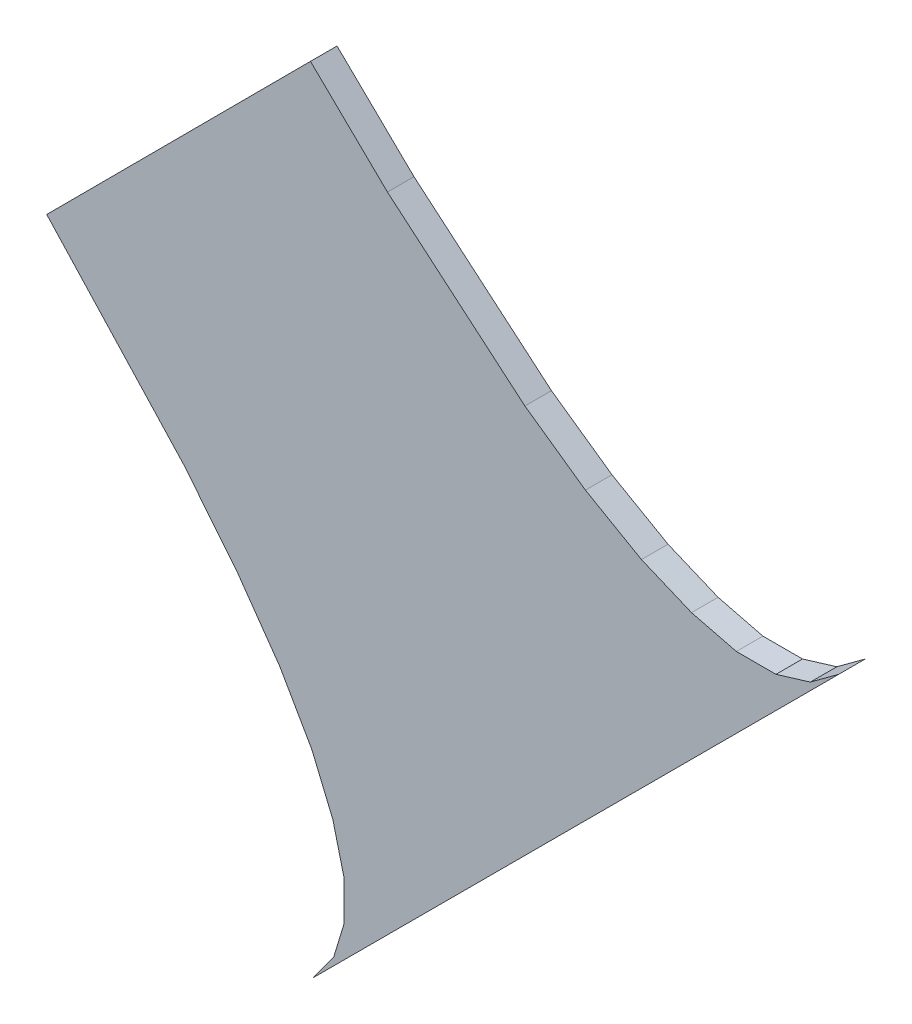
ISO-10303-21;
HEADER;
FILE_DESCRIPTION(('STEP AP214'),'2;1');
FILE_NAME('part.step','',(''),(''),'','','');
FILE_SCHEMA(('AUTOMOTIVE_DESIGN { 1 0 10303 214 1 1 1 1 }'));
ENDSEC;
DATA;
#1=APPLICATION_CONTEXT('core data for automotive mechanical design processes');
#2=APPLICATION_PROTOCOL_DEFINITION('international standard','automotive_design',2000,#1);
#3=PRODUCT_CONTEXT('',#1,'mechanical');
#4=PRODUCT('Part','Part','',(#3));
#5=PRODUCT_RELATED_PRODUCT_CATEGORY('part','',(#4));
#6=PRODUCT_DEFINITION_FORMATION('','',#4);
#7=PRODUCT_DEFINITION_CONTEXT('part definition',#1,'design');
#8=PRODUCT_DEFINITION('design','',#6,#7);
#9=PRODUCT_DEFINITION_SHAPE('','',#8);
#10=(LENGTH_UNIT() NAMED_UNIT(*) SI_UNIT(.MILLI.,.METRE.));
#11=(NAMED_UNIT(*) PLANE_ANGLE_UNIT() SI_UNIT($,.RADIAN.));
#12=(NAMED_UNIT(*) SI_UNIT($,.STERADIAN.) SOLID_ANGLE_UNIT());
#13=UNCERTAINTY_MEASURE_WITH_UNIT(LENGTH_MEASURE(1.E-05),#10,'distance_accuracy_value','');
#14=(GEOMETRIC_REPRESENTATION_CONTEXT(3) GLOBAL_UNCERTAINTY_ASSIGNED_CONTEXT((#13)) GLOBAL_UNIT_ASSIGNED_CONTEXT((#10,
#11,#12)) REPRESENTATION_CONTEXT('',''));
#15=CARTESIAN_POINT('',(0.,0.,0.));
#16=DIRECTION('',(0.,0.,1.));
#17=DIRECTION('',(1.,0.,0.));
#18=AXIS2_PLACEMENT_3D('',#15,#16,#17);
#19=CARTESIAN_POINT('',(78.6999969482422,83.5469970703125,0.));
#20=DIRECTION('',(0.734222558919782,0.678908855424119,0.));
#21=DIRECTION('',(0.678908855424119,-0.734222558919782,0.));
#22=AXIS2_PLACEMENT_3D('',#19,#20,#21);
#23=PLANE('',#22);
#24=DIRECTION('',(0.678908855424119,-0.734222558919782,0.));
#25=VECTOR('',#24,1.);
#26=CARTESIAN_POINT('',(78.6999969482422,83.5469970703125,0.03556));
#27=LINE('',#26,#25);
#28=CARTESIAN_POINT('',(78.6999969482422,83.5469970703125,0.03556));
#29=VERTEX_POINT('',#28);
#30=CARTESIAN_POINT('',(78.8840026855469,83.3479995727539,0.03556));
#31=VERTEX_POINT('',#30);
#32=EDGE_CURVE('E11',#29,#31,#27,.T.);
#33=ORIENTED_EDGE('',*,*,#32,.F.);
#34=DIRECTION('',(0.,0.,1.));
#35=VECTOR('',#34,1.);
#36=CARTESIAN_POINT('',(78.6999969482422,83.5469970703125,0.));
#37=LINE('',#36,#35);
#38=CARTESIAN_POINT('',(78.6999969482422,83.5469970703125,0.));
#39=VERTEX_POINT('',#38);
#40=EDGE_CURVE('E24',#39,#29,#37,.T.);
#41=ORIENTED_EDGE('',*,*,#40,.F.);
#42=DIRECTION('',(0.678908855424119,-0.734222558919782,0.));
#43=VECTOR('',#42,1.);
#44=CARTESIAN_POINT('',(78.6999969482422,83.5469970703125,0.));
#45=LINE('',#44,#43);
#46=CARTESIAN_POINT('',(78.8840026855469,83.3479995727539,0.));
#47=VERTEX_POINT('',#46);
#48=EDGE_CURVE('E172',#39,#47,#45,.T.);
#49=ORIENTED_EDGE('',*,*,#48,.T.);
#50=DIRECTION('',(0.,0.,1.));
#51=VECTOR('',#50,1.);
#52=CARTESIAN_POINT('',(78.8840026855469,83.3479995727539,0.));
#53=LINE('',#52,#51);
#54=EDGE_CURVE('E37',#47,#31,#53,.T.);
#55=ORIENTED_EDGE('',*,*,#54,.T.);
#56=EDGE_LOOP('',(#33,#41,#49,#55));
#57=FACE_BOUND('',#56,.T.);
#58=ADVANCED_FACE('F17',(#57),#23,.F.);
#59=CARTESIAN_POINT('',(78.8840026855469,83.3479995727539,0.));
#60=DIRECTION('',(0.778268366568721,0.627931803302282,0.));
#61=DIRECTION('',(0.627931803302282,-0.778268366568721,0.));
#62=AXIS2_PLACEMENT_3D('',#59,#60,#61);
#63=PLANE('',#62);
#64=DIRECTION('',(0.627931803302282,-0.778268366568721,0.));
#65=VECTOR('',#64,1.);
#66=CARTESIAN_POINT('',(78.8840026855469,83.3479995727539,0.03556));
#67=LINE('',#66,#65);
#68=CARTESIAN_POINT('',(78.9550018310547,83.2600021362305,0.03556));
#69=VERTEX_POINT('',#68);
#70=EDGE_CURVE('E308',#31,#69,#67,.T.);
#71=ORIENTED_EDGE('',*,*,#70,.F.);
#72=ORIENTED_EDGE('',*,*,#54,.F.);
#73=DIRECTION('',(0.627931803302282,-0.778268366568721,0.));
#74=VECTOR('',#73,1.);
#75=CARTESIAN_POINT('',(78.8840026855469,83.3479995727539,0.));
#76=LINE('',#75,#74);
#77=CARTESIAN_POINT('',(78.9550018310547,83.2600021362305,0.));
#78=VERTEX_POINT('',#77);
#79=EDGE_CURVE('E305',#47,#78,#76,.T.);
#80=ORIENTED_EDGE('',*,*,#79,.T.);
#81=DIRECTION('',(0.,0.,1.));
#82=VECTOR('',#81,1.);
#83=CARTESIAN_POINT('',(78.9550018310547,83.2600021362305,0.));
#84=LINE('',#83,#82);
#85=EDGE_CURVE('E303',#78,#69,#84,.T.);
#86=ORIENTED_EDGE('',*,*,#85,.T.);
#87=EDGE_LOOP('',(#71,#72,#80,#86));
#88=FACE_BOUND('',#87,.T.);
#89=ADVANCED_FACE('F316',(#88),#63,.F.);
#90=CARTESIAN_POINT('',(78.9550018310547,83.2600021362305,0.));
#91=DIRECTION('',(0.817814475440857,0.575481957805278,0.));
#92=DIRECTION('',(0.575481957805278,-0.817814475440857,0.));
#93=AXIS2_PLACEMENT_3D('',#90,#91,#92);
#94=PLANE('',#93);
#95=DIRECTION('',(0.575481957805278,-0.817814475440857,0.));
#96=VECTOR('',#95,1.);
#97=CARTESIAN_POINT('',(78.9550018310547,83.2600021362305,0.03556));
#98=LINE('',#97,#96);
#99=CARTESIAN_POINT('',(79.0120010375977,83.1790008544922,0.03556));
#100=VERTEX_POINT('',#99);
#101=EDGE_CURVE('E300',#69,#100,#98,.T.);
#102=ORIENTED_EDGE('',*,*,#101,.F.);
#103=ORIENTED_EDGE('',*,*,#85,.F.);
#104=DIRECTION('',(0.575481957805278,-0.817814475440857,0.));
#105=VECTOR('',#104,1.);
#106=CARTESIAN_POINT('',(78.9550018310547,83.2600021362305,0.));
#107=LINE('',#106,#105);
#108=CARTESIAN_POINT('',(79.0120010375977,83.1790008544922,0.));
#109=VERTEX_POINT('',#108);
#110=EDGE_CURVE('E297',#78,#109,#107,.T.);
#111=ORIENTED_EDGE('',*,*,#110,.T.);
#112=DIRECTION('',(0.,0.,1.));
#113=VECTOR('',#112,1.);
#114=CARTESIAN_POINT('',(79.0120010375977,83.1790008544922,0.));
#115=LINE('',#114,#113);
#116=EDGE_CURVE('E295',#109,#100,#115,.T.);
#117=ORIENTED_EDGE('',*,*,#116,.T.);
#118=EDGE_LOOP('',(#102,#103,#111,#117));
#119=FACE_BOUND('',#118,.T.);
#120=ADVANCED_FACE('F322',(#119),#94,.F.);
#121=CARTESIAN_POINT('',(79.0120010375977,83.1790008544922,0.));
#122=DIRECTION('',(0.867547182428413,0.497354889651768,0.));
#123=DIRECTION('',(0.497354889651768,-0.867547182428413,0.));
#124=AXIS2_PLACEMENT_3D('',#121,#122,#123);
#125=PLANE('',#124);
#126=DIRECTION('',(0.497354889651768,-0.867547182428413,0.));
#127=VECTOR('',#126,1.);
#128=CARTESIAN_POINT('',(79.0120010375977,83.1790008544922,0.03556));
#129=LINE('',#128,#127);
#130=CARTESIAN_POINT('',(79.0550003051758,83.1039962768555,0.03556));
#131=VERTEX_POINT('',#130);
#132=EDGE_CURVE('E292',#100,#131,#129,.T.);
#133=ORIENTED_EDGE('',*,*,#132,.F.);
#134=ORIENTED_EDGE('',*,*,#116,.F.);
#135=DIRECTION('',(0.497354889651768,-0.867547182428413,0.));
#136=VECTOR('',#135,1.);
#137=CARTESIAN_POINT('',(79.0120010375977,83.1790008544922,0.));
#138=LINE('',#137,#136);
#139=CARTESIAN_POINT('',(79.0550003051758,83.1039962768555,0.));
#140=VERTEX_POINT('',#139);
#141=EDGE_CURVE('E289',#109,#140,#138,.T.);
#142=ORIENTED_EDGE('',*,*,#141,.T.);
#143=DIRECTION('',(0.,0.,1.));
#144=VECTOR('',#143,1.);
#145=CARTESIAN_POINT('',(79.0550003051758,83.1039962768555,0.));
#146=LINE('',#145,#144);
#147=EDGE_CURVE('E287',#140,#131,#146,.T.);
#148=ORIENTED_EDGE('',*,*,#147,.T.);
#149=EDGE_LOOP('',(#133,#134,#142,#148));
#150=FACE_BOUND('',#149,.T.);
#151=ADVANCED_FACE('F324',(#150),#125,.F.);
#152=CARTESIAN_POINT('',(79.0550003051758,83.1039962768555,0.));
#153=DIRECTION('',(0.922656698433262,0.385622375953772,0.));
#154=DIRECTION('',(0.385622375953772,-0.922656698433262,0.));
#155=AXIS2_PLACEMENT_3D('',#152,#153,#154);
#156=PLANE('',#155);
#157=DIRECTION('',(0.385622375953772,-0.922656698433262,0.));
#158=VECTOR('',#157,1.);
#159=CARTESIAN_POINT('',(79.0550003051758,83.1039962768555,0.03556));
#160=LINE('',#159,#158);
#161=CARTESIAN_POINT('',(79.0830001831055,83.0370025634766,0.03556));
#162=VERTEX_POINT('',#161);
#163=EDGE_CURVE('E284',#131,#162,#160,.T.);
#164=ORIENTED_EDGE('',*,*,#163,.F.);
#165=ORIENTED_EDGE('',*,*,#147,.F.);
#166=DIRECTION('',(0.385622375953772,-0.922656698433262,0.));
#167=VECTOR('',#166,1.);
#168=CARTESIAN_POINT('',(79.0550003051758,83.1039962768555,0.));
#169=LINE('',#168,#167);
#170=CARTESIAN_POINT('',(79.0830001831055,83.0370025634766,0.));
#171=VERTEX_POINT('',#170);
#172=EDGE_CURVE('E281',#140,#171,#169,.T.);
#173=ORIENTED_EDGE('',*,*,#172,.T.);
#174=DIRECTION('',(0.,0.,1.));
#175=VECTOR('',#174,1.);
#176=CARTESIAN_POINT('',(79.0830001831055,83.0370025634766,0.));
#177=LINE('',#176,#175);
#178=EDGE_CURVE('E279',#171,#162,#177,.T.);
#179=ORIENTED_EDGE('',*,*,#178,.T.);
#180=EDGE_LOOP('',(#164,#165,#173,#179));
#181=FACE_BOUND('',#180,.T.);
#182=ADVANCED_FACE('F329',(#181),#156,.F.);
#183=CARTESIAN_POINT('',(79.0830001831055,83.0370025634766,0.));
#184=DIRECTION('',(0.970149755608538,0.242506601338383,0.));
#185=DIRECTION('',(0.242506601338383,-0.970149755608538,0.));
#186=AXIS2_PLACEMENT_3D('',#183,#184,#185);
#187=PLANE('',#186);
#188=DIRECTION('',(0.242506601338383,-0.970149755608538,0.));
#189=VECTOR('',#188,1.);
#190=CARTESIAN_POINT('',(79.0830001831055,83.0370025634766,0.03556));
#191=LINE('',#190,#189);
#192=CARTESIAN_POINT('',(79.0979995727539,82.9769973754883,0.03556));
#193=VERTEX_POINT('',#192);
#194=EDGE_CURVE('E276',#162,#193,#191,.T.);
#195=ORIENTED_EDGE('',*,*,#194,.F.);
#196=ORIENTED_EDGE('',*,*,#178,.F.);
#197=DIRECTION('',(0.242506601338383,-0.970149755608538,0.));
#198=VECTOR('',#197,1.);
#199=CARTESIAN_POINT('',(79.0830001831055,83.0370025634766,0.));
#200=LINE('',#199,#198);
#201=CARTESIAN_POINT('',(79.0979995727539,82.9769973754883,0.));
#202=VERTEX_POINT('',#201);
#203=EDGE_CURVE('E273',#171,#202,#200,.T.);
#204=ORIENTED_EDGE('',*,*,#203,.T.);
#205=DIRECTION('',(0.,0.,1.));
#206=VECTOR('',#205,1.);
#207=CARTESIAN_POINT('',(79.0979995727539,82.9769973754883,0.));
#208=LINE('',#207,#206);
#209=EDGE_CURVE('E271',#202,#193,#208,.T.);
#210=ORIENTED_EDGE('',*,*,#209,.T.);
#211=EDGE_LOOP('',(#195,#196,#204,#210));
#212=FACE_BOUND('',#211,.T.);
#213=ADVANCED_FACE('F332',(#212),#187,.F.);
#214=CARTESIAN_POINT('',(79.0979995727539,82.9769973754883,0.));
#215=DIRECTION('',(1.,0.,0.));
#216=DIRECTION('',(0.,-1.,0.));
#217=AXIS2_PLACEMENT_3D('',#214,#215,#216);
#218=PLANE('',#217);
#219=DIRECTION('',(0.,-1.,0.));
#220=VECTOR('',#219,1.);
#221=CARTESIAN_POINT('',(79.0979995727539,82.9769973754883,0.03556));
#222=LINE('',#221,#220);
#223=CARTESIAN_POINT('',(79.0979995727539,82.9240036010742,0.03556));
#224=VERTEX_POINT('',#223);
#225=EDGE_CURVE('E268',#193,#224,#222,.T.);
#226=ORIENTED_EDGE('',*,*,#225,.F.);
#227=ORIENTED_EDGE('',*,*,#209,.F.);
#228=DIRECTION('',(0.,-1.,0.));
#229=VECTOR('',#228,1.);
#230=CARTESIAN_POINT('',(79.0979995727539,82.9769973754883,0.));
#231=LINE('',#230,#229);
#232=CARTESIAN_POINT('',(79.0979995727539,82.9240036010742,0.));
#233=VERTEX_POINT('',#232);
#234=EDGE_CURVE('E265',#202,#233,#231,.T.);
#235=ORIENTED_EDGE('',*,*,#234,.T.);
#236=DIRECTION('',(0.,0.,1.));
#237=VECTOR('',#236,1.);
#238=CARTESIAN_POINT('',(79.0979995727539,82.9240036010742,0.));
#239=LINE('',#238,#237);
#240=EDGE_CURVE('E263',#233,#224,#239,.T.);
#241=ORIENTED_EDGE('',*,*,#240,.T.);
#242=EDGE_LOOP('',(#226,#227,#235,#241));
#243=FACE_BOUND('',#242,.T.);
#244=ADVANCED_FACE('F337',(#243),#218,.F.);
#245=CARTESIAN_POINT('',(79.0979995727539,82.9240036010742,0.));
#246=DIRECTION('',(0.956683486982875,-0.291130049521323,0.));
#247=DIRECTION('',(-0.291130049521323,-0.956683486982875,0.));
#248=AXIS2_PLACEMENT_3D('',#245,#246,#247);
#249=PLANE('',#248);
#250=DIRECTION('',(-0.291130049521323,-0.956683486982875,0.));
#251=VECTOR('',#250,1.);
#252=CARTESIAN_POINT('',(79.0979995727539,82.9240036010742,0.03556));
#253=LINE('',#252,#251);
#254=CARTESIAN_POINT('',(79.0839996337891,82.8779983520508,0.03556));
#255=VERTEX_POINT('',#254);
#256=EDGE_CURVE('E260',#224,#255,#253,.T.);
#257=ORIENTED_EDGE('',*,*,#256,.F.);
#258=ORIENTED_EDGE('',*,*,#240,.F.);
#259=DIRECTION('',(-0.291130049521323,-0.956683486982875,0.));
#260=VECTOR('',#259,1.);
#261=CARTESIAN_POINT('',(79.0979995727539,82.9240036010742,0.));
#262=LINE('',#261,#260);
#263=CARTESIAN_POINT('',(79.0839996337891,82.8779983520508,0.));
#264=VERTEX_POINT('',#263);
#265=EDGE_CURVE('E257',#233,#264,#262,.T.);
#266=ORIENTED_EDGE('',*,*,#265,.T.);
#267=DIRECTION('',(0.,0.,1.));
#268=VECTOR('',#267,1.);
#269=CARTESIAN_POINT('',(79.0839996337891,82.8779983520508,0.));
#270=LINE('',#269,#268);
#271=EDGE_CURVE('E255',#264,#255,#270,.T.);
#272=ORIENTED_EDGE('',*,*,#271,.T.);
#273=EDGE_LOOP('',(#257,#258,#266,#272));
#274=FACE_BOUND('',#273,.T.);
#275=ADVANCED_FACE('F340',(#274),#249,.F.);
#276=CARTESIAN_POINT('',(79.0839996337891,82.8779983520508,0.));
#277=DIRECTION('',(0.805072086965024,-0.593176984372945,0.));
#278=DIRECTION('',(-0.593176984372945,-0.805072086965024,0.));
#279=AXIS2_PLACEMENT_3D('',#276,#277,#278);
#280=PLANE('',#279);
#281=DIRECTION('',(-0.593176984372945,-0.805072086965024,0.));
#282=VECTOR('',#281,1.);
#283=CARTESIAN_POINT('',(79.0839996337891,82.8779983520508,0.03556));
#284=LINE('',#283,#282);
#285=CARTESIAN_POINT('',(79.0559997558594,82.8399963378906,0.03556));
#286=VERTEX_POINT('',#285);
#287=EDGE_CURVE('E252',#255,#286,#284,.T.);
#288=ORIENTED_EDGE('',*,*,#287,.F.);
#289=ORIENTED_EDGE('',*,*,#271,.F.);
#290=DIRECTION('',(-0.593176984372945,-0.805072086965024,0.));
#291=VECTOR('',#290,1.);
#292=CARTESIAN_POINT('',(79.0839996337891,82.8779983520508,0.));
#293=LINE('',#292,#291);
#294=CARTESIAN_POINT('',(79.0559997558594,82.8399963378906,0.));
#295=VERTEX_POINT('',#294);
#296=EDGE_CURVE('E249',#264,#295,#293,.T.);
#297=ORIENTED_EDGE('',*,*,#296,.T.);
#298=DIRECTION('',(0.,0.,1.));
#299=VECTOR('',#298,1.);
#300=CARTESIAN_POINT('',(79.0559997558594,82.8399963378906,0.));
#301=LINE('',#300,#299);
#302=EDGE_CURVE('E247',#295,#286,#301,.T.);
#303=ORIENTED_EDGE('',*,*,#302,.T.);
#304=EDGE_LOOP('',(#288,#289,#297,#303));
#305=FACE_BOUND('',#304,.T.);
#306=ADVANCED_FACE('F345',(#305),#280,.F.);
#307=CARTESIAN_POINT('',(79.0559997558594,82.8399963378906,0.));
#308=DIRECTION('',(-0.707106781186548,0.707106781186548,0.));
#309=DIRECTION('',(0.707106781186548,0.707106781186548,0.));
#310=AXIS2_PLACEMENT_3D('',#307,#308,#309);
#311=PLANE('',#310);
#312=DIRECTION('',(0.707106781186548,0.707106781186548,0.));
#313=VECTOR('',#312,1.);
#314=CARTESIAN_POINT('',(79.0559997558594,82.8399963378906,0.03556));
#315=LINE('',#314,#313);
#316=CARTESIAN_POINT('',(79.7600021362305,83.5439987182617,0.03556));
#317=VERTEX_POINT('',#316);
#318=EDGE_CURVE('E244',#286,#317,#315,.T.);
#319=ORIENTED_EDGE('',*,*,#318,.F.);
#320=ORIENTED_EDGE('',*,*,#302,.F.);
#321=DIRECTION('',(0.707106781186548,0.707106781186548,0.));
#322=VECTOR('',#321,1.);
#323=CARTESIAN_POINT('',(79.0559997558594,82.8399963378906,0.));
#324=LINE('',#323,#322);
#325=CARTESIAN_POINT('',(79.7600021362305,83.5439987182617,0.));
#326=VERTEX_POINT('',#325);
#327=EDGE_CURVE('E241',#295,#326,#324,.T.);
#328=ORIENTED_EDGE('',*,*,#327,.T.);
#329=DIRECTION('',(0.,0.,1.));
#330=VECTOR('',#329,1.);
#331=CARTESIAN_POINT('',(79.7600021362305,83.5439987182617,0.));
#332=LINE('',#331,#330);
#333=EDGE_CURVE('E239',#326,#317,#332,.T.);
#334=ORIENTED_EDGE('',*,*,#333,.T.);
#335=EDGE_LOOP('',(#319,#320,#328,#334));
#336=FACE_BOUND('',#335,.T.);
#337=ADVANCED_FACE('F348',(#336),#311,.F.);
#338=CARTESIAN_POINT('',(79.7600021362305,83.5439987182617,0.));
#339=DIRECTION('',(0.593176984372945,-0.805072086965024,0.));
#340=DIRECTION('',(-0.805072086965024,-0.593176984372945,0.));
#341=AXIS2_PLACEMENT_3D('',#338,#339,#340);
#342=PLANE('',#341);
#343=DIRECTION('',(-0.805072086965024,-0.593176984372945,0.));
#344=VECTOR('',#343,1.);
#345=CARTESIAN_POINT('',(79.7600021362305,83.5439987182617,0.03556));
#346=LINE('',#345,#344);
#347=CARTESIAN_POINT('',(79.7220001220703,83.515998840332,0.03556));
#348=VERTEX_POINT('',#347);
#349=EDGE_CURVE('E236',#317,#348,#346,.T.);
#350=ORIENTED_EDGE('',*,*,#349,.F.);
#351=ORIENTED_EDGE('',*,*,#333,.F.);
#352=DIRECTION('',(-0.805072086965024,-0.593176984372945,0.));
#353=VECTOR('',#352,1.);
#354=CARTESIAN_POINT('',(79.7600021362305,83.5439987182617,0.));
#355=LINE('',#354,#353);
#356=CARTESIAN_POINT('',(79.7220001220703,83.515998840332,0.));
#357=VERTEX_POINT('',#356);
#358=EDGE_CURVE('E233',#326,#357,#355,.T.);
#359=ORIENTED_EDGE('',*,*,#358,.T.);
#360=DIRECTION('',(0.,0.,1.));
#361=VECTOR('',#360,1.);
#362=CARTESIAN_POINT('',(79.7220001220703,83.515998840332,0.));
#363=LINE('',#362,#361);
#364=EDGE_CURVE('E231',#357,#348,#363,.T.);
#365=ORIENTED_EDGE('',*,*,#364,.T.);
#366=EDGE_LOOP('',(#350,#351,#359,#365));
#367=FACE_BOUND('',#366,.T.);
#368=ADVANCED_FACE('F353',(#367),#342,.F.);
#369=CARTESIAN_POINT('',(79.7220001220703,83.515998840332,0.));
#370=DIRECTION('',(0.291174244115219,-0.956670036932239,0.));
#371=DIRECTION('',(-0.956670036932239,-0.291174244115219,0.));
#372=AXIS2_PLACEMENT_3D('',#369,#370,#371);
#373=PLANE('',#372);
#374=DIRECTION('',(-0.956670036932239,-0.291174244115219,0.));
#375=VECTOR('',#374,1.);
#376=CARTESIAN_POINT('',(79.7220001220703,83.515998840332,0.03556));
#377=LINE('',#376,#375);
#378=CARTESIAN_POINT('',(79.6760025024414,83.5019989013672,0.03556));
#379=VERTEX_POINT('',#378);
#380=EDGE_CURVE('E228',#348,#379,#377,.T.);
#381=ORIENTED_EDGE('',*,*,#380,.F.);
#382=ORIENTED_EDGE('',*,*,#364,.F.);
#383=DIRECTION('',(-0.956670036932239,-0.291174244115219,0.));
#384=VECTOR('',#383,1.);
#385=CARTESIAN_POINT('',(79.7220001220703,83.515998840332,0.));
#386=LINE('',#385,#384);
#387=CARTESIAN_POINT('',(79.6760025024414,83.5019989013672,0.));
#388=VERTEX_POINT('',#387);
#389=EDGE_CURVE('E225',#357,#388,#386,.T.);
#390=ORIENTED_EDGE('',*,*,#389,.T.);
#391=DIRECTION('',(0.,0.,1.));
#392=VECTOR('',#391,1.);
#393=CARTESIAN_POINT('',(79.6760025024414,83.5019989013672,0.));
#394=LINE('',#393,#392);
#395=EDGE_CURVE('E223',#388,#379,#394,.T.);
#396=ORIENTED_EDGE('',*,*,#395,.T.);
#397=EDGE_LOOP('',(#381,#382,#390,#396));
#398=FACE_BOUND('',#397,.T.);
#399=ADVANCED_FACE('F356',(#398),#373,.F.);
#400=CARTESIAN_POINT('',(79.6760025024414,83.5019989013672,0.));
#401=DIRECTION('',(0.,-1.,0.));
#402=DIRECTION('',(-1.,0.,0.));
#403=AXIS2_PLACEMENT_3D('',#400,#401,#402);
#404=PLANE('',#403);
#405=DIRECTION('',(-1.,0.,0.));
#406=VECTOR('',#405,1.);
#407=CARTESIAN_POINT('',(79.6760025024414,83.5019989013672,0.03556));
#408=LINE('',#407,#406);
#409=CARTESIAN_POINT('',(79.6230010986328,83.5019989013672,0.03556));
#410=VERTEX_POINT('',#409);
#411=EDGE_CURVE('E220',#379,#410,#408,.T.);
#412=ORIENTED_EDGE('',*,*,#411,.F.);
#413=ORIENTED_EDGE('',*,*,#395,.F.);
#414=DIRECTION('',(-1.,0.,0.));
#415=VECTOR('',#414,1.);
#416=CARTESIAN_POINT('',(79.6760025024414,83.5019989013672,0.));
#417=LINE('',#416,#415);
#418=CARTESIAN_POINT('',(79.6230010986328,83.5019989013672,0.));
#419=VERTEX_POINT('',#418);
#420=EDGE_CURVE('E217',#388,#419,#417,.T.);
#421=ORIENTED_EDGE('',*,*,#420,.T.);
#422=DIRECTION('',(0.,0.,1.));
#423=VECTOR('',#422,1.);
#424=CARTESIAN_POINT('',(79.6230010986328,83.5019989013672,0.));
#425=LINE('',#424,#423);
#426=EDGE_CURVE('E215',#419,#410,#425,.T.);
#427=ORIENTED_EDGE('',*,*,#426,.T.);
#428=EDGE_LOOP('',(#412,#413,#421,#427));
#429=FACE_BOUND('',#428,.T.);
#430=ADVANCED_FACE('F361',(#429),#404,.F.);
#431=CARTESIAN_POINT('',(79.6230010986328,83.5019989013672,0.));
#432=DIRECTION('',(-0.242535625036333,-0.970142500145332,0.));
#433=DIRECTION('',(-0.970142500145332,0.242535625036333,0.));
#434=AXIS2_PLACEMENT_3D('',#431,#432,#433);
#435=PLANE('',#434);
#436=DIRECTION('',(-0.970142500145332,0.242535625036333,0.));
#437=VECTOR('',#436,1.);
#438=CARTESIAN_POINT('',(79.6230010986328,83.5019989013672,0.03556));
#439=LINE('',#438,#437);
#440=CARTESIAN_POINT('',(79.5630035400391,83.5169982910156,0.03556));
#441=VERTEX_POINT('',#440);
#442=EDGE_CURVE('E212',#410,#441,#439,.T.);
#443=ORIENTED_EDGE('',*,*,#442,.F.);
#444=ORIENTED_EDGE('',*,*,#426,.F.);
#445=DIRECTION('',(-0.970142500145332,0.242535625036333,0.));
#446=VECTOR('',#445,1.);
#447=CARTESIAN_POINT('',(79.6230010986328,83.5019989013672,0.));
#448=LINE('',#447,#446);
#449=CARTESIAN_POINT('',(79.5630035400391,83.5169982910156,0.));
#450=VERTEX_POINT('',#449);
#451=EDGE_CURVE('E209',#419,#450,#448,.T.);
#452=ORIENTED_EDGE('',*,*,#451,.T.);
#453=DIRECTION('',(0.,0.,1.));
#454=VECTOR('',#453,1.);
#455=CARTESIAN_POINT('',(79.5630035400391,83.5169982910156,0.));
#456=LINE('',#455,#454);
#457=EDGE_CURVE('E207',#450,#441,#456,.T.);
#458=ORIENTED_EDGE('',*,*,#457,.T.);
#459=EDGE_LOOP('',(#443,#444,#452,#458));
#460=FACE_BOUND('',#459,.T.);
#461=ADVANCED_FACE('F364',(#460),#435,.F.);
#462=CARTESIAN_POINT('',(79.5630035400391,83.5169982910156,0.));
#463=DIRECTION('',(-0.385584994163033,-0.922672321182495,0.));
#464=DIRECTION('',(-0.922672321182495,0.385584994163033,0.));
#465=AXIS2_PLACEMENT_3D('',#462,#463,#464);
#466=PLANE('',#465);
#467=DIRECTION('',(-0.922672321182495,0.385584994163033,0.));
#468=VECTOR('',#467,1.);
#469=CARTESIAN_POINT('',(79.5630035400391,83.5169982910156,0.03556));
#470=LINE('',#469,#468);
#471=CARTESIAN_POINT('',(79.4960021972656,83.5449981689453,0.03556));
#472=VERTEX_POINT('',#471);
#473=EDGE_CURVE('E204',#441,#472,#470,.T.);
#474=ORIENTED_EDGE('',*,*,#473,.F.);
#475=ORIENTED_EDGE('',*,*,#457,.F.);
#476=DIRECTION('',(-0.922672321182495,0.385584994163033,0.));
#477=VECTOR('',#476,1.);
#478=CARTESIAN_POINT('',(79.5630035400391,83.5169982910156,0.));
#479=LINE('',#478,#477);
#480=CARTESIAN_POINT('',(79.4960021972656,83.5449981689453,0.));
#481=VERTEX_POINT('',#480);
#482=EDGE_CURVE('E201',#450,#481,#479,.T.);
#483=ORIENTED_EDGE('',*,*,#482,.T.);
#484=DIRECTION('',(0.,0.,1.));
#485=VECTOR('',#484,1.);
#486=CARTESIAN_POINT('',(79.4960021972656,83.5449981689453,0.));
#487=LINE('',#486,#485);
#488=EDGE_CURVE('E199',#481,#472,#487,.T.);
#489=ORIENTED_EDGE('',*,*,#488,.T.);
#490=EDGE_LOOP('',(#474,#475,#483,#489));
#491=FACE_BOUND('',#490,.T.);
#492=ADVANCED_FACE('F369',(#491),#466,.F.);
#493=CARTESIAN_POINT('',(79.4960021972656,83.5449981689453,0.));
#494=DIRECTION('',(-0.497354889651768,-0.867547182428413,0.));
#495=DIRECTION('',(-0.867547182428413,0.497354889651768,0.));
#496=AXIS2_PLACEMENT_3D('',#493,#494,#495);
#497=PLANE('',#496);
#498=DIRECTION('',(-0.867547182428413,0.497354889651768,0.));
#499=VECTOR('',#498,1.);
#500=CARTESIAN_POINT('',(79.4960021972656,83.5449981689453,0.03556));
#501=LINE('',#500,#499);
#502=CARTESIAN_POINT('',(79.4209976196289,83.5879974365234,0.03556));
#503=VERTEX_POINT('',#502);
#504=EDGE_CURVE('E196',#472,#503,#501,.T.);
#505=ORIENTED_EDGE('',*,*,#504,.F.);
#506=ORIENTED_EDGE('',*,*,#488,.F.);
#507=DIRECTION('',(-0.867547182428413,0.497354889651768,0.));
#508=VECTOR('',#507,1.);
#509=CARTESIAN_POINT('',(79.4960021972656,83.5449981689453,0.));
#510=LINE('',#509,#508);
#511=CARTESIAN_POINT('',(79.4209976196289,83.5879974365234,0.));
#512=VERTEX_POINT('',#511);
#513=EDGE_CURVE('E193',#481,#512,#510,.T.);
#514=ORIENTED_EDGE('',*,*,#513,.T.);
#515=DIRECTION('',(0.,0.,1.));
#516=VECTOR('',#515,1.);
#517=CARTESIAN_POINT('',(79.4209976196289,83.5879974365234,0.));
#518=LINE('',#517,#516);
#519=EDGE_CURVE('E191',#512,#503,#518,.T.);
#520=ORIENTED_EDGE('',*,*,#519,.T.);
#521=EDGE_LOOP('',(#505,#506,#514,#520));
#522=FACE_BOUND('',#521,.T.);
#523=ADVANCED_FACE('F372',(#522),#497,.F.);
#524=CARTESIAN_POINT('',(79.4209976196289,83.5879974365234,0.));
#525=DIRECTION('',(-0.575481957805278,-0.817814475440857,0.));
#526=DIRECTION('',(-0.817814475440857,0.575481957805278,0.));
#527=AXIS2_PLACEMENT_3D('',#524,#525,#526);
#528=PLANE('',#527);
#529=DIRECTION('',(-0.817814475440857,0.575481957805278,0.));
#530=VECTOR('',#529,1.);
#531=CARTESIAN_POINT('',(79.4209976196289,83.5879974365234,0.03556));
#532=LINE('',#531,#530);
#533=CARTESIAN_POINT('',(79.3399963378906,83.6449966430664,0.03556));
#534=VERTEX_POINT('',#533);
#535=EDGE_CURVE('E188',#503,#534,#532,.T.);
#536=ORIENTED_EDGE('',*,*,#535,.F.);
#537=ORIENTED_EDGE('',*,*,#519,.F.);
#538=DIRECTION('',(-0.817814475440857,0.575481957805278,0.));
#539=VECTOR('',#538,1.);
#540=CARTESIAN_POINT('',(79.4209976196289,83.5879974365234,0.));
#541=LINE('',#540,#539);
#542=CARTESIAN_POINT('',(79.3399963378906,83.6449966430664,0.));
#543=VERTEX_POINT('',#542);
#544=EDGE_CURVE('E185',#512,#543,#541,.T.);
#545=ORIENTED_EDGE('',*,*,#544,.T.);
#546=DIRECTION('',(0.,0.,1.));
#547=VECTOR('',#546,1.);
#548=CARTESIAN_POINT('',(79.3399963378906,83.6449966430664,0.));
#549=LINE('',#548,#547);
#550=EDGE_CURVE('E183',#543,#534,#549,.T.);
#551=ORIENTED_EDGE('',*,*,#550,.T.);
#552=EDGE_LOOP('',(#536,#537,#545,#551));
#553=FACE_BOUND('',#552,.T.);
#554=ADVANCED_FACE('F377',(#553),#528,.F.);
#555=CARTESIAN_POINT('',(79.3399963378906,83.6449966430664,0.));
#556=DIRECTION('',(-0.646703251817644,-0.762741702077764,0.));
#557=DIRECTION('',(-0.762741702077764,0.646703251817644,0.));
#558=AXIS2_PLACEMENT_3D('',#555,#556,#557);
#559=PLANE('',#558);
#560=DIRECTION('',(-0.762741702077764,0.646703251817644,0.));
#561=VECTOR('',#560,1.);
#562=CARTESIAN_POINT('',(79.3399963378906,83.6449966430664,0.03556));
#563=LINE('',#562,#561);
#564=CARTESIAN_POINT('',(79.1559982299805,83.8010025024414,0.03556));
#565=VERTEX_POINT('',#564);
#566=EDGE_CURVE('E180',#534,#565,#563,.T.);
#567=ORIENTED_EDGE('',*,*,#566,.F.);
#568=ORIENTED_EDGE('',*,*,#550,.F.);
#569=DIRECTION('',(-0.762741702077764,0.646703251817644,0.));
#570=VECTOR('',#569,1.);
#571=CARTESIAN_POINT('',(79.3399963378906,83.6449966430664,0.));
#572=LINE('',#571,#570);
#573=CARTESIAN_POINT('',(79.1559982299805,83.8010025024414,0.));
#574=VERTEX_POINT('',#573);
#575=EDGE_CURVE('E178',#543,#574,#572,.T.);
#576=ORIENTED_EDGE('',*,*,#575,.T.);
#577=DIRECTION('',(0.,0.,1.));
#578=VECTOR('',#577,1.);
#579=CARTESIAN_POINT('',(79.1559982299805,83.8010025024414,0.));
#580=LINE('',#579,#578);
#581=EDGE_CURVE('E163',#574,#565,#580,.T.);
#582=ORIENTED_EDGE('',*,*,#581,.T.);
#583=EDGE_LOOP('',(#567,#568,#576,#582));
#584=FACE_BOUND('',#583,.T.);
#585=ADVANCED_FACE('F379',(#584),#559,.F.);
#586=CARTESIAN_POINT('',(79.1559982299805,83.8010025024414,0.));
#587=DIRECTION('',(-0.696586443071641,-0.717472875674613,0.));
#588=DIRECTION('',(-0.717472875674613,0.696586443071641,0.));
#589=AXIS2_PLACEMENT_3D('',#586,#587,#588);
#590=PLANE('',#589);
#591=DIRECTION('',(-0.717472875674613,0.696586443071641,0.));
#592=VECTOR('',#591,1.);
#593=CARTESIAN_POINT('',(79.1559982299805,83.8010025024414,0.03556));
#594=LINE('',#593,#592);
#595=CARTESIAN_POINT('',(79.0530014038086,83.9010009765625,0.03556));
#596=VERTEX_POINT('',#595);
#597=EDGE_CURVE('E167',#565,#596,#594,.T.);
#598=ORIENTED_EDGE('',*,*,#597,.F.);
#599=ORIENTED_EDGE('',*,*,#581,.F.);
#600=DIRECTION('',(-0.717472875674613,0.696586443071641,0.));
#601=VECTOR('',#600,1.);
#602=CARTESIAN_POINT('',(79.1559982299805,83.8010025024414,0.));
#603=LINE('',#602,#601);
#604=CARTESIAN_POINT('',(79.0530014038086,83.9010009765625,0.));
#605=VERTEX_POINT('',#604);
#606=EDGE_CURVE('E159',#574,#605,#603,.T.);
#607=ORIENTED_EDGE('',*,*,#606,.T.);
#608=DIRECTION('',(0.,0.,1.));
#609=VECTOR('',#608,1.);
#610=CARTESIAN_POINT('',(79.0530014038086,83.9010009765625,0.));
#611=LINE('',#610,#609);
#612=EDGE_CURVE('E149',#605,#596,#611,.T.);
#613=ORIENTED_EDGE('',*,*,#612,.T.);
#614=EDGE_LOOP('',(#598,#599,#607,#613));
#615=FACE_BOUND('',#614,.T.);
#616=ADVANCED_FACE('F162',(#615),#590,.F.);
#617=CARTESIAN_POINT('',(79.0530014038086,83.9010009765625,0.));
#618=DIRECTION('',(0.70810566347454,-0.706106485847058,0.));
#619=DIRECTION('',(-0.706106485847058,-0.70810566347454,0.));
#620=AXIS2_PLACEMENT_3D('',#617,#618,#619);
#621=PLANE('',#620);
#622=DIRECTION('',(-0.706106485847058,-0.70810566347454,0.));
#623=VECTOR('',#622,1.);
#624=CARTESIAN_POINT('',(79.0530014038086,83.9010009765625,0.03556));
#625=LINE('',#624,#623);
#626=EDGE_CURVE('E155',#596,#29,#625,.T.);
#627=ORIENTED_EDGE('',*,*,#626,.F.);
#628=ORIENTED_EDGE('',*,*,#612,.F.);
#629=DIRECTION('',(-0.706106485847058,-0.70810566347454,0.));
#630=VECTOR('',#629,1.);
#631=CARTESIAN_POINT('',(79.0530014038086,83.9010009765625,0.));
#632=LINE('',#631,#630);
#633=EDGE_CURVE('E153',#605,#39,#632,.T.);
#634=ORIENTED_EDGE('',*,*,#633,.T.);
#635=ORIENTED_EDGE('',*,*,#40,.T.);
#636=EDGE_LOOP('',(#627,#628,#634,#635));
#637=FACE_BOUND('',#636,.T.);
#638=ADVANCED_FACE('F151',(#637),#621,.F.);
#639=CARTESIAN_POINT('',(78.6999969482422,83.5469970703125,0.));
#640=DIRECTION('',(0.,0.,1.));
#641=DIRECTION('',(1.,0.,0.));
#642=AXIS2_PLACEMENT_3D('',#639,#640,#641);
#643=PLANE('',#642);
#644=ORIENTED_EDGE('',*,*,#633,.F.);
#645=ORIENTED_EDGE('',*,*,#606,.F.);
#646=ORIENTED_EDGE('',*,*,#575,.F.);
#647=ORIENTED_EDGE('',*,*,#544,.F.);
#648=ORIENTED_EDGE('',*,*,#513,.F.);
#649=ORIENTED_EDGE('',*,*,#482,.F.);
#650=ORIENTED_EDGE('',*,*,#451,.F.);
#651=ORIENTED_EDGE('',*,*,#420,.F.);
#652=ORIENTED_EDGE('',*,*,#389,.F.);
#653=ORIENTED_EDGE('',*,*,#358,.F.);
#654=ORIENTED_EDGE('',*,*,#327,.F.);
#655=ORIENTED_EDGE('',*,*,#296,.F.);
#656=ORIENTED_EDGE('',*,*,#265,.F.);
#657=ORIENTED_EDGE('',*,*,#234,.F.);
#658=ORIENTED_EDGE('',*,*,#203,.F.);
#659=ORIENTED_EDGE('',*,*,#172,.F.);
#660=ORIENTED_EDGE('',*,*,#141,.F.);
#661=ORIENTED_EDGE('',*,*,#110,.F.);
#662=ORIENTED_EDGE('',*,*,#79,.F.);
#663=ORIENTED_EDGE('',*,*,#48,.F.);
#664=EDGE_LOOP('',(#644,#645,#646,#647,#648,#649,#650,#651,#652,#653,#654,#655,#656,#657,#658,
#659,#660,#661,#662,#663));
#665=FACE_BOUND('',#664,.T.);
#666=ADVANCED_FACE('F170',(#665),#643,.F.);
#667=CARTESIAN_POINT('',(78.6999969482422,83.5469970703125,0.03556));
#668=DIRECTION('',(0.,0.,1.));
#669=DIRECTION('',(1.,0.,0.));
#670=AXIS2_PLACEMENT_3D('',#667,#668,#669);
#671=PLANE('',#670);
#672=ORIENTED_EDGE('',*,*,#32,.T.);
#673=ORIENTED_EDGE('',*,*,#70,.T.);
#674=ORIENTED_EDGE('',*,*,#101,.T.);
#675=ORIENTED_EDGE('',*,*,#132,.T.);
#676=ORIENTED_EDGE('',*,*,#163,.T.);
#677=ORIENTED_EDGE('',*,*,#194,.T.);
#678=ORIENTED_EDGE('',*,*,#225,.T.);
#679=ORIENTED_EDGE('',*,*,#256,.T.);
#680=ORIENTED_EDGE('',*,*,#287,.T.);
#681=ORIENTED_EDGE('',*,*,#318,.T.);
#682=ORIENTED_EDGE('',*,*,#349,.T.);
#683=ORIENTED_EDGE('',*,*,#380,.T.);
#684=ORIENTED_EDGE('',*,*,#411,.T.);
#685=ORIENTED_EDGE('',*,*,#442,.T.);
#686=ORIENTED_EDGE('',*,*,#473,.T.);
#687=ORIENTED_EDGE('',*,*,#504,.T.);
#688=ORIENTED_EDGE('',*,*,#535,.T.);
#689=ORIENTED_EDGE('',*,*,#566,.T.);
#690=ORIENTED_EDGE('',*,*,#597,.T.);
#691=ORIENTED_EDGE('',*,*,#626,.T.);
#692=EDGE_LOOP('',(#672,#673,#674,#675,#676,#677,#678,#679,#680,#681,#682,#683,#684,#685,#686,
#687,#688,#689,#690,#691));
#693=FACE_BOUND('',#692,.T.);
#694=ADVANCED_FACE('F319',(#693),#671,.T.);
#695=CLOSED_SHELL('',(#58,#89,#120,#151,#182,#213,#244,#275,#306,#337,#368,#399,#430,#461,#492,
#523,#554,#585,#616,#638,#666,#694));
#696=MANIFOLD_SOLID_BREP('B1',#695);
#697=ADVANCED_BREP_SHAPE_REPRESENTATION('',(#18,#696),#14);
#698=SHAPE_DEFINITION_REPRESENTATION(#9,#697);
ENDSEC;
END-ISO-10303-21;
